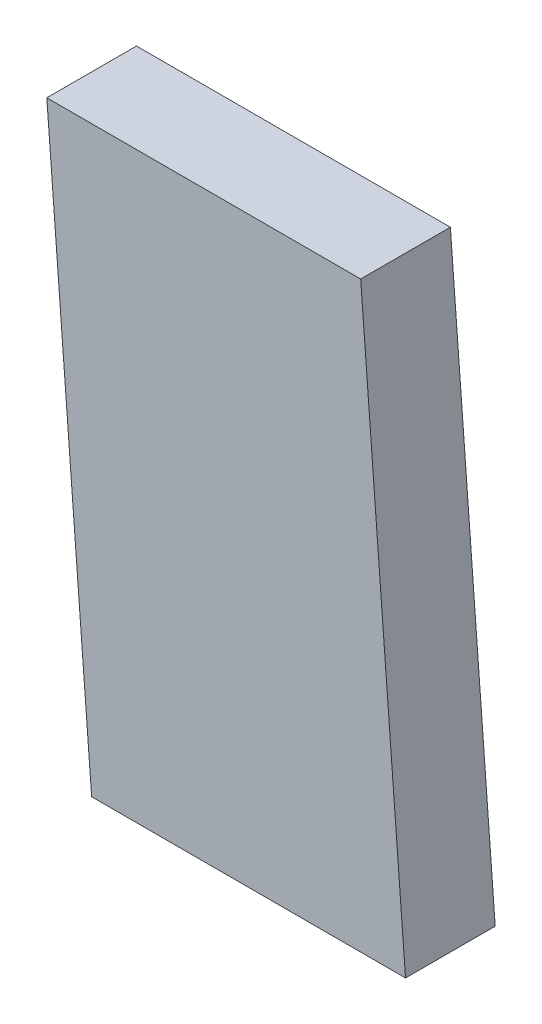
ISO-10303-21;
HEADER;
FILE_DESCRIPTION(('STEP AP214'),'2;1');
FILE_NAME('part.step','',(''),(''),'','','');
FILE_SCHEMA(('AUTOMOTIVE_DESIGN { 1 0 10303 214 1 1 1 1 }'));
ENDSEC;
DATA;
#1=APPLICATION_CONTEXT('core data for automotive mechanical design processes');
#2=APPLICATION_PROTOCOL_DEFINITION('international standard','automotive_design',2000,#1);
#3=PRODUCT_CONTEXT('',#1,'mechanical');
#4=PRODUCT('Part','Part','',(#3));
#5=PRODUCT_RELATED_PRODUCT_CATEGORY('part','',(#4));
#6=PRODUCT_DEFINITION_FORMATION('','',#4);
#7=PRODUCT_DEFINITION_CONTEXT('part definition',#1,'design');
#8=PRODUCT_DEFINITION('design','',#6,#7);
#9=PRODUCT_DEFINITION_SHAPE('','',#8);
#10=(LENGTH_UNIT() NAMED_UNIT(*) SI_UNIT(.MILLI.,.METRE.));
#11=(NAMED_UNIT(*) PLANE_ANGLE_UNIT() SI_UNIT($,.RADIAN.));
#12=(NAMED_UNIT(*) SI_UNIT($,.STERADIAN.) SOLID_ANGLE_UNIT());
#13=UNCERTAINTY_MEASURE_WITH_UNIT(LENGTH_MEASURE(1.E-05),#10,'distance_accuracy_value','');
#14=(GEOMETRIC_REPRESENTATION_CONTEXT(3) GLOBAL_UNCERTAINTY_ASSIGNED_CONTEXT((#13)) GLOBAL_UNIT_ASSIGNED_CONTEXT((#10,
#11,#12)) REPRESENTATION_CONTEXT('',''));
#15=CARTESIAN_POINT('',(0.,0.,0.));
#16=DIRECTION('',(0.,0.,1.));
#17=DIRECTION('',(1.,0.,0.));
#18=AXIS2_PLACEMENT_3D('',#15,#16,#17);
#19=CARTESIAN_POINT('',(4570.,450.,20.));
#20=DIRECTION('',(0.,1.,0.));
#21=DIRECTION('',(0.,0.,1.));
#22=AXIS2_PLACEMENT_3D('',#19,#20,#21);
#23=PLANE('',#22);
#24=DIRECTION('',(1.,0.,0.));
#25=VECTOR('',#24,1.);
#26=CARTESIAN_POINT('',(4570.,450.,0.));
#27=LINE('',#26,#25);
#28=CARTESIAN_POINT('',(4500.,450.,0.));
#29=VERTEX_POINT('',#28);
#30=CARTESIAN_POINT('',(4570.,450.,0.));
#31=VERTEX_POINT('',#30);
#32=EDGE_CURVE('E105',#29,#31,#27,.T.);
#33=ORIENTED_EDGE('',*,*,#32,.T.);
#34=DIRECTION('',(0.,0.,-1.));
#35=VECTOR('',#34,1.);
#36=CARTESIAN_POINT('',(4570.,450.,20.));
#37=LINE('',#36,#35);
#38=CARTESIAN_POINT('',(4570.,450.,20.));
#39=VERTEX_POINT('',#38);
#40=EDGE_CURVE('E11',#39,#31,#37,.T.);
#41=ORIENTED_EDGE('',*,*,#40,.F.);
#42=DIRECTION('',(1.,0.,0.));
#43=VECTOR('',#42,1.);
#44=CARTESIAN_POINT('',(4570.,450.,20.));
#45=LINE('',#44,#43);
#46=CARTESIAN_POINT('',(4500.,450.,20.));
#47=VERTEX_POINT('',#46);
#48=EDGE_CURVE('E89',#47,#39,#45,.T.);
#49=ORIENTED_EDGE('',*,*,#48,.F.);
#50=DIRECTION('',(0.,0.,-1.));
#51=VECTOR('',#50,1.);
#52=CARTESIAN_POINT('',(4500.,450.,20.));
#53=LINE('',#52,#51);
#54=EDGE_CURVE('E97',#47,#29,#53,.T.);
#55=ORIENTED_EDGE('',*,*,#54,.T.);
#56=EDGE_LOOP('',(#33,#41,#49,#55));
#57=FACE_BOUND('',#56,.T.);
#58=ADVANCED_FACE('F39',(#57),#23,.F.);
#59=CARTESIAN_POINT('',(4560.,580.,20.));
#60=DIRECTION('',(-0.997054485501581,-0.0766964988847422,0.));
#61=DIRECTION('',(0.0766964988847422,-0.997054485501581,0.));
#62=AXIS2_PLACEMENT_3D('',#59,#60,#61);
#63=PLANE('',#62);
#64=DIRECTION('',(-0.0766964988847422,0.997054485501581,0.));
#65=VECTOR('',#64,1.);
#66=CARTESIAN_POINT('',(4560.,580.,0.));
#67=LINE('',#66,#65);
#68=CARTESIAN_POINT('',(4560.,580.,0.));
#69=VERTEX_POINT('',#68);
#70=EDGE_CURVE('E92',#31,#69,#67,.T.);
#71=ORIENTED_EDGE('',*,*,#70,.T.);
#72=DIRECTION('',(0.,0.,-1.));
#73=VECTOR('',#72,1.);
#74=CARTESIAN_POINT('',(4560.,580.,20.));
#75=LINE('',#74,#73);
#76=CARTESIAN_POINT('',(4560.,580.,20.));
#77=VERTEX_POINT('',#76);
#78=EDGE_CURVE('E50',#77,#69,#75,.T.);
#79=ORIENTED_EDGE('',*,*,#78,.F.);
#80=DIRECTION('',(-0.0766964988847422,0.997054485501581,0.));
#81=VECTOR('',#80,1.);
#82=CARTESIAN_POINT('',(4560.,580.,20.));
#83=LINE('',#82,#81);
#84=EDGE_CURVE('E82',#39,#77,#83,.T.);
#85=ORIENTED_EDGE('',*,*,#84,.F.);
#86=ORIENTED_EDGE('',*,*,#40,.T.);
#87=EDGE_LOOP('',(#71,#79,#85,#86));
#88=FACE_BOUND('',#87,.T.);
#89=ADVANCED_FACE('F93',(#88),#63,.F.);
#90=CARTESIAN_POINT('',(4490.,580.,20.));
#91=DIRECTION('',(0.,-1.,0.));
#92=DIRECTION('',(0.,0.,-1.));
#93=AXIS2_PLACEMENT_3D('',#90,#91,#92);
#94=PLANE('',#93);
#95=DIRECTION('',(-1.,0.,0.));
#96=VECTOR('',#95,1.);
#97=CARTESIAN_POINT('',(4490.,580.,0.));
#98=LINE('',#97,#96);
#99=CARTESIAN_POINT('',(4490.,580.,0.));
#100=VERTEX_POINT('',#99);
#101=EDGE_CURVE('E72',#69,#100,#98,.T.);
#102=ORIENTED_EDGE('',*,*,#101,.T.);
#103=DIRECTION('',(0.,0.,-1.));
#104=VECTOR('',#103,1.);
#105=CARTESIAN_POINT('',(4490.,580.,20.));
#106=LINE('',#105,#104);
#107=CARTESIAN_POINT('',(4490.,580.,20.));
#108=VERTEX_POINT('',#107);
#109=EDGE_CURVE('E94',#108,#100,#106,.T.);
#110=ORIENTED_EDGE('',*,*,#109,.F.);
#111=DIRECTION('',(-1.,0.,0.));
#112=VECTOR('',#111,1.);
#113=CARTESIAN_POINT('',(4490.,580.,20.));
#114=LINE('',#113,#112);
#115=EDGE_CURVE('E88',#77,#108,#114,.T.);
#116=ORIENTED_EDGE('',*,*,#115,.F.);
#117=ORIENTED_EDGE('',*,*,#78,.T.);
#118=EDGE_LOOP('',(#102,#110,#116,#117));
#119=FACE_BOUND('',#118,.T.);
#120=ADVANCED_FACE('F96',(#119),#94,.F.);
#121=CARTESIAN_POINT('',(4500.,450.,20.));
#122=DIRECTION('',(0.997054485501582,0.0766964988847355,0.));
#123=DIRECTION('',(-0.0766964988847355,0.997054485501582,0.));
#124=AXIS2_PLACEMENT_3D('',#121,#122,#123);
#125=PLANE('',#124);
#126=DIRECTION('',(0.0766964988847355,-0.997054485501582,0.));
#127=VECTOR('',#126,1.);
#128=CARTESIAN_POINT('',(4500.,450.,0.));
#129=LINE('',#128,#127);
#130=EDGE_CURVE('E76',#100,#29,#129,.T.);
#131=ORIENTED_EDGE('',*,*,#130,.T.);
#132=ORIENTED_EDGE('',*,*,#54,.F.);
#133=DIRECTION('',(0.0766964988847355,-0.997054485501582,0.));
#134=VECTOR('',#133,1.);
#135=CARTESIAN_POINT('',(4500.,450.,20.));
#136=LINE('',#135,#134);
#137=EDGE_CURVE('E54',#108,#47,#136,.T.);
#138=ORIENTED_EDGE('',*,*,#137,.F.);
#139=ORIENTED_EDGE('',*,*,#109,.T.);
#140=EDGE_LOOP('',(#131,#132,#138,#139));
#141=FACE_BOUND('',#140,.T.);
#142=ADVANCED_FACE('F108',(#141),#125,.F.);
#143=CARTESIAN_POINT('',(0.,0.,20.));
#144=DIRECTION('',(0.,0.,-1.));
#145=DIRECTION('',(-1.,0.,0.));
#146=AXIS2_PLACEMENT_3D('',#143,#144,#145);
#147=PLANE('',#146);
#148=ORIENTED_EDGE('',*,*,#48,.T.);
#149=ORIENTED_EDGE('',*,*,#84,.T.);
#150=ORIENTED_EDGE('',*,*,#115,.T.);
#151=ORIENTED_EDGE('',*,*,#137,.T.);
#152=EDGE_LOOP('',(#148,#149,#150,#151));
#153=FACE_BOUND('',#152,.T.);
#154=ADVANCED_FACE('F86',(#153),#147,.F.);
#155=CARTESIAN_POINT('',(0.,0.,0.));
#156=DIRECTION('',(0.,0.,-1.));
#157=DIRECTION('',(-1.,0.,0.));
#158=AXIS2_PLACEMENT_3D('',#155,#156,#157);
#159=PLANE('',#158);
#160=ORIENTED_EDGE('',*,*,#32,.F.);
#161=ORIENTED_EDGE('',*,*,#130,.F.);
#162=ORIENTED_EDGE('',*,*,#101,.F.);
#163=ORIENTED_EDGE('',*,*,#70,.F.);
#164=EDGE_LOOP('',(#160,#161,#162,#163));
#165=FACE_BOUND('',#164,.T.);
#166=ADVANCED_FACE('F115',(#165),#159,.T.);
#167=CLOSED_SHELL('',(#58,#89,#120,#142,#154,#166));
#168=MANIFOLD_SOLID_BREP('B2',#167);
#169=ADVANCED_BREP_SHAPE_REPRESENTATION('',(#18,#168),#14);
#170=SHAPE_DEFINITION_REPRESENTATION(#9,#169);
ENDSEC;
END-ISO-10303-21;
